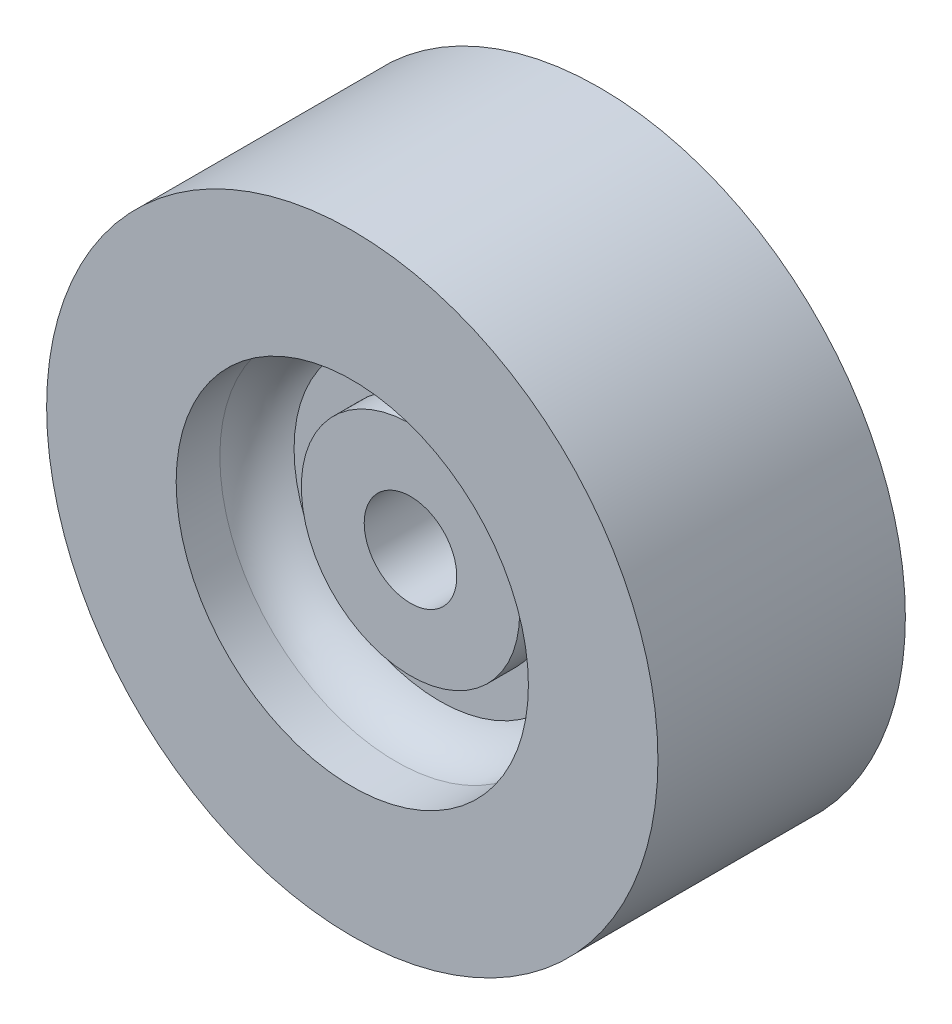
ISO-10303-21;
HEADER;
FILE_DESCRIPTION(('STEP AP214'),'2;1');
FILE_NAME('part.step','',(''),(''),'','','');
FILE_SCHEMA(('AUTOMOTIVE_DESIGN { 1 0 10303 214 1 1 1 1 }'));
ENDSEC;
DATA;
#1=APPLICATION_CONTEXT('core data for automotive mechanical design processes');
#2=APPLICATION_PROTOCOL_DEFINITION('international standard','automotive_design',2000,#1);
#3=PRODUCT_CONTEXT('',#1,'mechanical');
#4=PRODUCT('Part','Part','',(#3));
#5=PRODUCT_RELATED_PRODUCT_CATEGORY('part','',(#4));
#6=PRODUCT_DEFINITION_FORMATION('','',#4);
#7=PRODUCT_DEFINITION_CONTEXT('part definition',#1,'design');
#8=PRODUCT_DEFINITION('design','',#6,#7);
#9=PRODUCT_DEFINITION_SHAPE('','',#8);
#10=(LENGTH_UNIT() NAMED_UNIT(*) SI_UNIT(.MILLI.,.METRE.));
#11=(NAMED_UNIT(*) PLANE_ANGLE_UNIT() SI_UNIT($,.RADIAN.));
#12=(NAMED_UNIT(*) SI_UNIT($,.STERADIAN.) SOLID_ANGLE_UNIT());
#13=UNCERTAINTY_MEASURE_WITH_UNIT(LENGTH_MEASURE(1.E-05),#10,'distance_accuracy_value','');
#14=(GEOMETRIC_REPRESENTATION_CONTEXT(3) GLOBAL_UNCERTAINTY_ASSIGNED_CONTEXT((#13)) GLOBAL_UNIT_ASSIGNED_CONTEXT((#10,
#11,#12)) REPRESENTATION_CONTEXT('',''));
#15=CARTESIAN_POINT('',(0.,0.,0.));
#16=DIRECTION('',(0.,0.,1.));
#17=DIRECTION('',(1.,0.,0.));
#18=AXIS2_PLACEMENT_3D('',#15,#16,#17);
#19=CARTESIAN_POINT('',(0.,14.8643377747842,-0.989288217676224));
#20=DIRECTION('',(0.,0.,1.));
#21=DIRECTION('',(1.,0.,0.));
#22=AXIS2_PLACEMENT_3D('',#19,#20,#21);
#23=PLANE('',#22);
#24=CARTESIAN_POINT('',(0.,0.,-0.989288217676224));
#25=DIRECTION('',(0.,0.,1.));
#26=DIRECTION('',(1.,0.,0.));
#27=AXIS2_PLACEMENT_3D('',#24,#25,#26);
#28=CIRCLE('',#27,12.9920362298803);
#29=CARTESIAN_POINT('',(12.9920362298803,0.,-0.989288217676224));
#30=VERTEX_POINT('',#29);
#31=EDGE_CURVE('E55',#30,#30,#28,.T.);
#32=ORIENTED_EDGE('',*,*,#31,.T.);
#33=EDGE_LOOP('',(#32));
#34=FACE_BOUND('',#33,.T.);
#35=CARTESIAN_POINT('',(0.,0.,-0.989288217676224));
#36=DIRECTION('',(0.,0.,1.));
#37=DIRECTION('',(1.,0.,0.));
#38=AXIS2_PLACEMENT_3D('',#35,#36,#37);
#39=CIRCLE('',#38,14.);
#40=CARTESIAN_POINT('',(14.,0.,-0.989288217676224));
#41=VERTEX_POINT('',#40);
#42=EDGE_CURVE('E10',#41,#41,#39,.T.);
#43=ORIENTED_EDGE('',*,*,#42,.F.);
#44=EDGE_LOOP('',(#43));
#45=FACE_BOUND('',#44,.T.);
#46=ADVANCED_FACE('F32',(#34,#45),#23,.F.);
#47=CARTESIAN_POINT('',(0.,0.,13.2758684783822));
#48=DIRECTION('',(0.,0.,1.));
#49=DIRECTION('',(1.,0.,0.));
#50=AXIS2_PLACEMENT_3D('',#47,#48,#49);
#51=CYLINDRICAL_SURFACE('',#50,10.);
#52=CARTESIAN_POINT('',(0.,0.,-4.08678064728896));
#53=DIRECTION('',(0.,0.,1.));
#54=DIRECTION('',(1.,0.,0.));
#55=AXIS2_PLACEMENT_3D('',#52,#53,#54);
#56=CIRCLE('',#55,10.);
#57=CARTESIAN_POINT('',(10.,0.,-4.08678064728896));
#58=VERTEX_POINT('',#57);
#59=EDGE_CURVE('E52',#58,#58,#56,.T.);
#60=ORIENTED_EDGE('',*,*,#59,.F.);
#61=EDGE_LOOP('',(#60));
#62=FACE_BOUND('',#61,.T.);
#63=CARTESIAN_POINT('',(0.,0.,-7.08678064728897));
#64=DIRECTION('',(0.,0.,-1.));
#65=DIRECTION('',(-1.,0.,0.));
#66=AXIS2_PLACEMENT_3D('',#63,#64,#65);
#67=CIRCLE('',#66,10.);
#68=CARTESIAN_POINT('',(-10.,0.,-7.08678064728897));
#69=VERTEX_POINT('',#68);
#70=EDGE_CURVE('E58',#69,#69,#67,.F.);
#71=ORIENTED_EDGE('',*,*,#70,.T.);
#72=EDGE_LOOP('',(#71));
#73=FACE_BOUND('',#72,.T.);
#74=ADVANCED_FACE('F101',(#62,#73),#51,.T.);
#75=CARTESIAN_POINT('',(0.,0.,0.398342716023291));
#76=DIRECTION('',(0.,0.,1.));
#77=DIRECTION('',(1.,0.,0.));
#78=AXIS2_PLACEMENT_3D('',#75,#76,#77);
#79=TOROIDAL_SURFACE('',#78,8.35338438042927,3.76661470575);
#80=CARTESIAN_POINT('',(0.,0.,-2.98928821767622));
#81=DIRECTION('',(0.,0.,1.));
#82=DIRECTION('',(1.,0.,0.));
#83=AXIS2_PLACEMENT_3D('',#80,#81,#82);
#84=CIRCLE('',#83,10.);
#85=CARTESIAN_POINT('',(10.,0.,-2.98928821767622));
#86=VERTEX_POINT('',#85);
#87=EDGE_CURVE('E39',#86,#86,#84,.T.);
#88=ORIENTED_EDGE('',*,*,#87,.F.);
#89=EDGE_LOOP('',(#88));
#90=FACE_BOUND('',#89,.T.);
#91=CARTESIAN_POINT('',(0.,0.,0.0107117823237753));
#92=DIRECTION('',(0.,0.,1.));
#93=DIRECTION('',(1.,0.,0.));
#94=AXIS2_PLACEMENT_3D('',#91,#92,#93);
#95=CIRCLE('',#94,12.1);
#96=CARTESIAN_POINT('',(12.1,0.,0.0107117823237753));
#97=VERTEX_POINT('',#96);
#98=EDGE_CURVE('E77',#97,#97,#95,.T.);
#99=ORIENTED_EDGE('',*,*,#98,.T.);
#100=EDGE_LOOP('',(#99));
#101=FACE_BOUND('',#100,.T.);
#102=ADVANCED_FACE('F34',(#90,#101),#79,.F.);
#103=CARTESIAN_POINT('',(0.,10.,-2.98928821767622));
#104=DIRECTION('',(0.,0.,-1.));
#105=DIRECTION('',(-1.,0.,0.));
#106=AXIS2_PLACEMENT_3D('',#103,#104,#105);
#107=PLANE('',#106);
#108=CARTESIAN_POINT('',(0.,0.,-2.98928821767622));
#109=DIRECTION('',(0.,0.,1.));
#110=DIRECTION('',(1.,0.,0.));
#111=AXIS2_PLACEMENT_3D('',#108,#109,#110);
#112=CIRCLE('',#111,7.5);
#113=CARTESIAN_POINT('',(7.5,0.,-2.98928821767622));
#114=VERTEX_POINT('',#113);
#115=EDGE_CURVE('E43',#114,#114,#112,.T.);
#116=ORIENTED_EDGE('',*,*,#115,.F.);
#117=EDGE_LOOP('',(#116));
#118=FACE_BOUND('',#117,.T.);
#119=ORIENTED_EDGE('',*,*,#87,.T.);
#120=EDGE_LOOP('',(#119));
#121=FACE_BOUND('',#120,.T.);
#122=ADVANCED_FACE('F125',(#118,#121),#107,.F.);
#123=CARTESIAN_POINT('',(0.,0.,13.2758684783822));
#124=DIRECTION('',(0.,0.,1.));
#125=DIRECTION('',(1.,0.,0.));
#126=AXIS2_PLACEMENT_3D('',#123,#124,#125);
#127=CYLINDRICAL_SURFACE('',#126,7.5);
#128=CARTESIAN_POINT('',(0.,0.,-0.989288217676224));
#129=DIRECTION('',(0.,0.,1.));
#130=DIRECTION('',(1.,0.,0.));
#131=AXIS2_PLACEMENT_3D('',#128,#129,#130);
#132=CIRCLE('',#131,7.5);
#133=CARTESIAN_POINT('',(7.5,0.,-0.989288217676224));
#134=VERTEX_POINT('',#133);
#135=EDGE_CURVE('E47',#134,#134,#132,.T.);
#136=ORIENTED_EDGE('',*,*,#135,.F.);
#137=EDGE_LOOP('',(#136));
#138=FACE_BOUND('',#137,.T.);
#139=ORIENTED_EDGE('',*,*,#115,.T.);
#140=EDGE_LOOP('',(#139));
#141=FACE_BOUND('',#140,.T.);
#142=ADVANCED_FACE('F122',(#138,#141),#127,.T.);
#143=CARTESIAN_POINT('',(0.,7.5,-0.989288217676225));
#144=DIRECTION('',(0.,0.,-1.));
#145=DIRECTION('',(-1.,0.,0.));
#146=AXIS2_PLACEMENT_3D('',#143,#144,#145);
#147=PLANE('',#146);
#148=CARTESIAN_POINT('',(0.,0.,-0.989288217676226));
#149=DIRECTION('',(0.,0.,-1.));
#150=DIRECTION('',(-1.,0.,0.));
#151=AXIS2_PLACEMENT_3D('',#148,#149,#150);
#152=CIRCLE('',#151,3.1816928621684);
#153=CARTESIAN_POINT('',(-3.1816928621684,0.,-0.989288217676226));
#154=VERTEX_POINT('',#153);
#155=EDGE_CURVE('E61',#154,#154,#152,.T.);
#156=ORIENTED_EDGE('',*,*,#155,.T.);
#157=EDGE_LOOP('',(#156));
#158=FACE_BOUND('',#157,.T.);
#159=ORIENTED_EDGE('',*,*,#135,.T.);
#160=EDGE_LOOP('',(#159));
#161=FACE_BOUND('',#160,.T.);
#162=ADVANCED_FACE('F117',(#158,#161),#147,.F.);
#163=CARTESIAN_POINT('',(0.,0.,0.112339894836238));
#164=DIRECTION('',(0.,0.,1.));
#165=DIRECTION('',(1.,0.,0.));
#166=AXIS2_PLACEMENT_3D('',#163,#164,#165);
#167=TOROIDAL_SURFACE('',#166,8.75222967664356,4.38058718748376);
#168=ORIENTED_EDGE('',*,*,#31,.F.);
#169=EDGE_LOOP('',(#168));
#170=FACE_BOUND('',#169,.T.);
#171=ORIENTED_EDGE('',*,*,#59,.T.);
#172=EDGE_LOOP('',(#171));
#173=FACE_BOUND('',#172,.T.);
#174=ADVANCED_FACE('F115',(#170,#173),#167,.T.);
#175=CARTESIAN_POINT('',(0.,0.,-7.08678064728897));
#176=DIRECTION('',(0.,0.,-1.));
#177=DIRECTION('',(-1.,0.,0.));
#178=AXIS2_PLACEMENT_3D('',#175,#176,#177);
#179=PLANE('',#178);
#180=CARTESIAN_POINT('',(0.,0.,-7.08678064728897));
#181=DIRECTION('',(0.,0.,-1.));
#182=DIRECTION('',(-1.,0.,0.));
#183=AXIS2_PLACEMENT_3D('',#180,#181,#182);
#184=CIRCLE('',#183,3.1816928621684);
#185=CARTESIAN_POINT('',(-3.1816928621684,0.,-7.08678064728897));
#186=VERTEX_POINT('',#185);
#187=EDGE_CURVE('E64',#186,#186,#184,.T.);
#188=ORIENTED_EDGE('',*,*,#187,.F.);
#189=EDGE_LOOP('',(#188));
#190=FACE_BOUND('',#189,.T.);
#191=ORIENTED_EDGE('',*,*,#70,.F.);
#192=EDGE_LOOP('',(#191));
#193=FACE_BOUND('',#192,.T.);
#194=ADVANCED_FACE('F113',(#190,#193),#179,.T.);
#195=CARTESIAN_POINT('',(0.,0.,18.913219352711));
#196=DIRECTION('',(0.,0.,-1.));
#197=DIRECTION('',(-1.,0.,0.));
#198=AXIS2_PLACEMENT_3D('',#195,#196,#197);
#199=CYLINDRICAL_SURFACE('',#198,3.1816928621684);
#200=ORIENTED_EDGE('',*,*,#187,.T.);
#201=EDGE_LOOP('',(#200));
#202=FACE_BOUND('',#201,.T.);
#203=ORIENTED_EDGE('',*,*,#155,.F.);
#204=EDGE_LOOP('',(#203));
#205=FACE_BOUND('',#204,.T.);
#206=ADVANCED_FACE('F164',(#202,#205),#199,.F.);
#207=CARTESIAN_POINT('',(0.,0.,-13.9892882176762));
#208=DIRECTION('',(0.,0.,1.));
#209=DIRECTION('',(1.,0.,0.));
#210=AXIS2_PLACEMENT_3D('',#207,#208,#209);
#211=CYLINDRICAL_SURFACE('',#210,14.);
#212=CARTESIAN_POINT('',(0.,0.,-13.9892882176762));
#213=DIRECTION('',(0.,0.,1.));
#214=DIRECTION('',(1.,0.,0.));
#215=AXIS2_PLACEMENT_3D('',#212,#213,#214);
#216=CIRCLE('',#215,14.);
#217=CARTESIAN_POINT('',(14.,0.,-13.9892882176762));
#218=VERTEX_POINT('',#217);
#219=EDGE_CURVE('E70',#218,#218,#216,.T.);
#220=ORIENTED_EDGE('',*,*,#219,.F.);
#221=EDGE_LOOP('',(#220));
#222=FACE_BOUND('',#221,.T.);
#223=ORIENTED_EDGE('',*,*,#42,.T.);
#224=EDGE_LOOP('',(#223));
#225=FACE_BOUND('',#224,.T.);
#226=ADVANCED_FACE('F171',(#222,#225),#211,.F.);
#227=CARTESIAN_POINT('',(0.,0.,-13.9892882176762));
#228=DIRECTION('',(0.,0.,1.));
#229=DIRECTION('',(1.,0.,0.));
#230=AXIS2_PLACEMENT_3D('',#227,#228,#229);
#231=CYLINDRICAL_SURFACE('',#230,21.);
#232=CARTESIAN_POINT('',(0.,0.,-13.9892882176762));
#233=DIRECTION('',(0.,0.,1.));
#234=DIRECTION('',(1.,0.,0.));
#235=AXIS2_PLACEMENT_3D('',#232,#233,#234);
#236=CIRCLE('',#235,21.);
#237=CARTESIAN_POINT('',(21.,0.,-13.9892882176762));
#238=VERTEX_POINT('',#237);
#239=EDGE_CURVE('E67',#238,#238,#236,.T.);
#240=ORIENTED_EDGE('',*,*,#239,.T.);
#241=EDGE_LOOP('',(#240));
#242=FACE_BOUND('',#241,.T.);
#243=CARTESIAN_POINT('',(0.,0.,3.01071178232378));
#244=DIRECTION('',(0.,0.,1.));
#245=DIRECTION('',(1.,0.,0.));
#246=AXIS2_PLACEMENT_3D('',#243,#244,#245);
#247=CIRCLE('',#246,21.);
#248=CARTESIAN_POINT('',(21.,0.,3.01071178232378));
#249=VERTEX_POINT('',#248);
#250=EDGE_CURVE('E73',#249,#249,#247,.T.);
#251=ORIENTED_EDGE('',*,*,#250,.F.);
#252=EDGE_LOOP('',(#251));
#253=FACE_BOUND('',#252,.T.);
#254=ADVANCED_FACE('F96',(#242,#253),#231,.T.);
#255=CARTESIAN_POINT('',(0.,0.,-13.9892882176762));
#256=DIRECTION('',(0.,0.,1.));
#257=DIRECTION('',(1.,0.,0.));
#258=AXIS2_PLACEMENT_3D('',#255,#256,#257);
#259=PLANE('',#258);
#260=ORIENTED_EDGE('',*,*,#219,.T.);
#261=EDGE_LOOP('',(#260));
#262=FACE_BOUND('',#261,.T.);
#263=ORIENTED_EDGE('',*,*,#239,.F.);
#264=EDGE_LOOP('',(#263));
#265=FACE_BOUND('',#264,.T.);
#266=ADVANCED_FACE('F88',(#262,#265),#259,.F.);
#267=CARTESIAN_POINT('',(0.,0.,3.01071178232378));
#268=DIRECTION('',(0.,0.,1.));
#269=DIRECTION('',(1.,0.,0.));
#270=AXIS2_PLACEMENT_3D('',#267,#268,#269);
#271=PLANE('',#270);
#272=ORIENTED_EDGE('',*,*,#250,.T.);
#273=EDGE_LOOP('',(#272));
#274=FACE_BOUND('',#273,.T.);
#275=CARTESIAN_POINT('',(0.,0.,3.01071178232378));
#276=DIRECTION('',(0.,0.,1.));
#277=DIRECTION('',(1.,0.,0.));
#278=AXIS2_PLACEMENT_3D('',#275,#276,#277);
#279=CIRCLE('',#278,12.1);
#280=CARTESIAN_POINT('',(12.1,0.,3.01071178232378));
#281=VERTEX_POINT('',#280);
#282=EDGE_CURVE('E76',#281,#281,#279,.T.);
#283=ORIENTED_EDGE('',*,*,#282,.F.);
#284=EDGE_LOOP('',(#283));
#285=FACE_BOUND('',#284,.T.);
#286=ADVANCED_FACE('F86',(#274,#285),#271,.T.);
#287=CARTESIAN_POINT('',(0.,0.,3.01071178232378));
#288=DIRECTION('',(0.,0.,-1.));
#289=DIRECTION('',(-1.,0.,0.));
#290=AXIS2_PLACEMENT_3D('',#287,#288,#289);
#291=CYLINDRICAL_SURFACE('',#290,12.1);
#292=ORIENTED_EDGE('',*,*,#282,.T.);
#293=EDGE_LOOP('',(#292));
#294=FACE_BOUND('',#293,.T.);
#295=ORIENTED_EDGE('',*,*,#98,.F.);
#296=EDGE_LOOP('',(#295));
#297=FACE_BOUND('',#296,.T.);
#298=ADVANCED_FACE('F83',(#294,#297),#291,.F.);
#299=CLOSED_SHELL('',(#46,#74,#102,#122,#142,#162,#174,#194,#206,#226,#254,#266,#286,#298));
#300=MANIFOLD_SOLID_BREP('B2',#299);
#301=ADVANCED_BREP_SHAPE_REPRESENTATION('',(#18,#300),#14);
#302=SHAPE_DEFINITION_REPRESENTATION(#9,#301);
ENDSEC;
END-ISO-10303-21;
